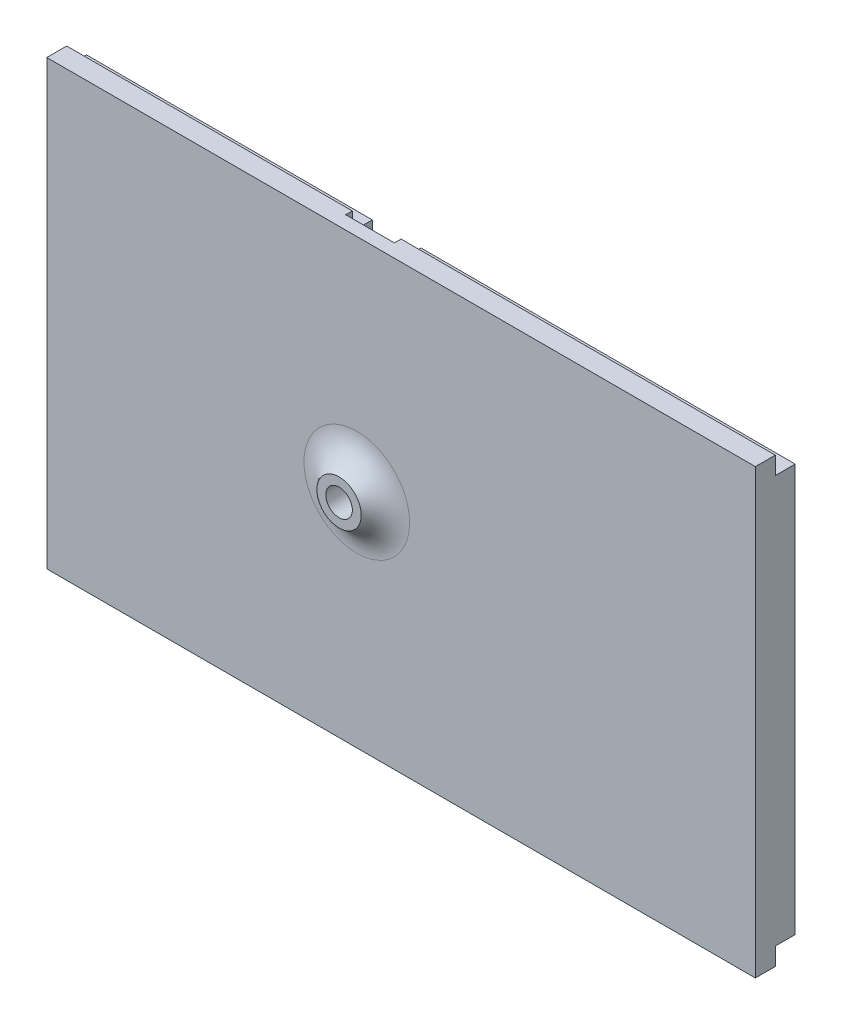
ISO-10303-21;
HEADER;
FILE_DESCRIPTION(('STEP AP214'),'2;1');
FILE_NAME('part.step','',(''),(''),'','','');
FILE_SCHEMA(('AUTOMOTIVE_DESIGN { 1 0 10303 214 1 1 1 1 }'));
ENDSEC;
DATA;
#1=APPLICATION_CONTEXT('core data for automotive mechanical design processes');
#2=APPLICATION_PROTOCOL_DEFINITION('international standard','automotive_design',2000,#1);
#3=PRODUCT_CONTEXT('',#1,'mechanical');
#4=PRODUCT('Part','Part','',(#3));
#5=PRODUCT_RELATED_PRODUCT_CATEGORY('part','',(#4));
#6=PRODUCT_DEFINITION_FORMATION('','',#4);
#7=PRODUCT_DEFINITION_CONTEXT('part definition',#1,'design');
#8=PRODUCT_DEFINITION('design','',#6,#7);
#9=PRODUCT_DEFINITION_SHAPE('','',#8);
#10=(LENGTH_UNIT() NAMED_UNIT(*) SI_UNIT(.MILLI.,.METRE.));
#11=(NAMED_UNIT(*) PLANE_ANGLE_UNIT() SI_UNIT($,.RADIAN.));
#12=(NAMED_UNIT(*) SI_UNIT($,.STERADIAN.) SOLID_ANGLE_UNIT());
#13=UNCERTAINTY_MEASURE_WITH_UNIT(LENGTH_MEASURE(1.E-05),#10,'distance_accuracy_value','');
#14=(GEOMETRIC_REPRESENTATION_CONTEXT(3) GLOBAL_UNCERTAINTY_ASSIGNED_CONTEXT((#13)) GLOBAL_UNIT_ASSIGNED_CONTEXT((#10,
#11,#12)) REPRESENTATION_CONTEXT('',''));
#15=CARTESIAN_POINT('',(0.,0.,0.));
#16=DIRECTION('',(0.,0.,1.));
#17=DIRECTION('',(1.,0.,0.));
#18=AXIS2_PLACEMENT_3D('',#15,#16,#17);
#19=CARTESIAN_POINT('',(0.,50.,2.24999999999999));
#20=DIRECTION('',(0.,0.,1.));
#21=DIRECTION('',(1.,0.,0.));
#22=AXIS2_PLACEMENT_3D('',#19,#20,#21);
#23=PLANE('',#22);
#24=DIRECTION('',(-1.,0.,0.));
#25=VECTOR('',#24,1.);
#26=CARTESIAN_POINT('',(0.,50.,2.24999999999999));
#27=LINE('',#26,#25);
#28=CARTESIAN_POINT('',(-47.75,50.,2.24999999999999));
#29=VERTEX_POINT('',#28);
#30=CARTESIAN_POINT('',(-80.,50.,2.24999999999999));
#31=VERTEX_POINT('',#30);
#32=EDGE_CURVE('E235',#29,#31,#27,.T.);
#33=ORIENTED_EDGE('',*,*,#32,.F.);
#34=DIRECTION('',(0.,-1.,0.));
#35=VECTOR('',#34,1.);
#36=CARTESIAN_POINT('',(-47.75,50.,2.24999999999999));
#37=LINE('',#36,#35);
#38=CARTESIAN_POINT('',(-47.75,48.,2.24999999999999));
#39=VERTEX_POINT('',#38);
#40=EDGE_CURVE('E154',#29,#39,#37,.T.);
#41=ORIENTED_EDGE('',*,*,#40,.T.);
#42=DIRECTION('',(-1.,0.,0.));
#43=VECTOR('',#42,1.);
#44=CARTESIAN_POINT('',(0.,48.,2.24999999999999));
#45=LINE('',#44,#43);
#46=CARTESIAN_POINT('',(-80.,48.,2.24999999999999));
#47=VERTEX_POINT('',#46);
#48=EDGE_CURVE('E240',#39,#47,#45,.T.);
#49=ORIENTED_EDGE('',*,*,#48,.T.);
#50=DIRECTION('',(0.,1.,0.));
#51=VECTOR('',#50,1.);
#52=CARTESIAN_POINT('',(-80.,50.,2.24999999999999));
#53=LINE('',#52,#51);
#54=EDGE_CURVE('E218',#47,#31,#53,.T.);
#55=ORIENTED_EDGE('',*,*,#54,.T.);
#56=EDGE_LOOP('',(#33,#41,#49,#55));
#57=FACE_BOUND('',#56,.T.);
#58=ADVANCED_FACE('F45',(#57),#23,.F.);
#59=CARTESIAN_POINT('',(0.,48.,2.24999999999999));
#60=DIRECTION('',(0.,-1.,0.));
#61=DIRECTION('',(0.,0.,-1.));
#62=AXIS2_PLACEMENT_3D('',#59,#60,#61);
#63=PLANE('',#62);
#64=ORIENTED_EDGE('',*,*,#48,.F.);
#65=DIRECTION('',(0.,0.,-1.));
#66=VECTOR('',#65,1.);
#67=CARTESIAN_POINT('',(-47.75,48.,2.24999999999999));
#68=LINE('',#67,#66);
#69=CARTESIAN_POINT('',(-47.75,48.,0.));
#70=VERTEX_POINT('',#69);
#71=EDGE_CURVE('E11',#39,#70,#68,.T.);
#72=ORIENTED_EDGE('',*,*,#71,.T.);
#73=DIRECTION('',(-1.,0.,0.));
#74=VECTOR('',#73,1.);
#75=CARTESIAN_POINT('',(0.,48.,0.));
#76=LINE('',#75,#74);
#77=CARTESIAN_POINT('',(-80.,48.,0.));
#78=VERTEX_POINT('',#77);
#79=EDGE_CURVE('E222',#70,#78,#76,.T.);
#80=ORIENTED_EDGE('',*,*,#79,.T.);
#81=DIRECTION('',(0.,0.,1.));
#82=VECTOR('',#81,1.);
#83=CARTESIAN_POINT('',(-80.,48.,2.24999999999999));
#84=LINE('',#83,#82);
#85=EDGE_CURVE('E223',#78,#47,#84,.T.);
#86=ORIENTED_EDGE('',*,*,#85,.T.);
#87=EDGE_LOOP('',(#64,#72,#80,#86));
#88=FACE_BOUND('',#87,.T.);
#89=ADVANCED_FACE('F332',(#88),#63,.F.);
#90=CARTESIAN_POINT('',(0.,0.,4.5));
#91=DIRECTION('',(0.,-1.,0.));
#92=DIRECTION('',(1.,0.,0.));
#93=AXIS2_PLACEMENT_3D('',#90,#91,#92);
#94=PLANE('',#93);
#95=DIRECTION('',(-1.,0.,0.));
#96=VECTOR('',#95,1.);
#97=CARTESIAN_POINT('',(0.,0.,2.25));
#98=LINE('',#97,#96);
#99=CARTESIAN_POINT('',(0.,0.,2.25));
#100=VERTEX_POINT('',#99);
#101=CARTESIAN_POINT('',(-80.,0.,2.25));
#102=VERTEX_POINT('',#101);
#103=EDGE_CURVE('E244',#100,#102,#98,.T.);
#104=ORIENTED_EDGE('',*,*,#103,.F.);
#105=DIRECTION('',(0.,0.,-1.));
#106=VECTOR('',#105,1.);
#107=CARTESIAN_POINT('',(0.,0.,4.5));
#108=LINE('',#107,#106);
#109=CARTESIAN_POINT('',(0.,0.,4.5));
#110=VERTEX_POINT('',#109);
#111=EDGE_CURVE('E289',#110,#100,#108,.T.);
#112=ORIENTED_EDGE('',*,*,#111,.F.);
#113=DIRECTION('',(-1.,0.,0.));
#114=VECTOR('',#113,1.);
#115=CARTESIAN_POINT('',(0.,0.,4.5));
#116=LINE('',#115,#114);
#117=CARTESIAN_POINT('',(-80.,0.,4.5));
#118=VERTEX_POINT('',#117);
#119=EDGE_CURVE('E267',#110,#118,#116,.T.);
#120=ORIENTED_EDGE('',*,*,#119,.T.);
#121=DIRECTION('',(0.,0.,-1.));
#122=VECTOR('',#121,1.);
#123=CARTESIAN_POINT('',(-80.,0.,4.5));
#124=LINE('',#123,#122);
#125=EDGE_CURVE('E282',#118,#102,#124,.T.);
#126=ORIENTED_EDGE('',*,*,#125,.T.);
#127=EDGE_LOOP('',(#104,#112,#120,#126));
#128=FACE_BOUND('',#127,.T.);
#129=ADVANCED_FACE('F350',(#128),#94,.T.);
#130=CARTESIAN_POINT('',(0.,0.,4.5));
#131=DIRECTION('',(-1.,0.,0.));
#132=DIRECTION('',(0.,0.,1.));
#133=AXIS2_PLACEMENT_3D('',#130,#131,#132);
#134=PLANE('',#133);
#135=DIRECTION('',(0.,0.,1.));
#136=VECTOR('',#135,1.);
#137=CARTESIAN_POINT('',(0.,48.,2.24999999999999));
#138=LINE('',#137,#136);
#139=CARTESIAN_POINT('',(0.,48.,0.));
#140=VERTEX_POINT('',#139);
#141=CARTESIAN_POINT('',(0.,48.,2.24999999999999));
#142=VERTEX_POINT('',#141);
#143=EDGE_CURVE('E69',#140,#142,#138,.T.);
#144=ORIENTED_EDGE('',*,*,#143,.T.);
#145=DIRECTION('',(0.,1.,0.));
#146=VECTOR('',#145,1.);
#147=CARTESIAN_POINT('',(0.,50.,2.24999999999999));
#148=LINE('',#147,#146);
#149=CARTESIAN_POINT('',(0.,50.,2.24999999999999));
#150=VERTEX_POINT('',#149);
#151=EDGE_CURVE('E217',#142,#150,#148,.T.);
#152=ORIENTED_EDGE('',*,*,#151,.T.);
#153=DIRECTION('',(0.,0.,-1.));
#154=VECTOR('',#153,1.);
#155=CARTESIAN_POINT('',(0.,50.,4.5));
#156=LINE('',#155,#154);
#157=CARTESIAN_POINT('',(0.,50.,4.5));
#158=VERTEX_POINT('',#157);
#159=EDGE_CURVE('E294',#158,#150,#156,.T.);
#160=ORIENTED_EDGE('',*,*,#159,.F.);
#161=DIRECTION('',(0.,1.,0.));
#162=VECTOR('',#161,1.);
#163=CARTESIAN_POINT('',(0.,0.,4.5));
#164=LINE('',#163,#162);
#165=EDGE_CURVE('E279',#110,#158,#164,.T.);
#166=ORIENTED_EDGE('',*,*,#165,.F.);
#167=ORIENTED_EDGE('',*,*,#111,.T.);
#168=DIRECTION('',(0.,1.,0.));
#169=VECTOR('',#168,1.);
#170=CARTESIAN_POINT('',(0.,0.,2.25));
#171=LINE('',#170,#169);
#172=CARTESIAN_POINT('',(0.,1.99999999999999,2.25));
#173=VERTEX_POINT('',#172);
#174=EDGE_CURVE('E257',#100,#173,#171,.T.);
#175=ORIENTED_EDGE('',*,*,#174,.T.);
#176=DIRECTION('',(0.,0.,-1.));
#177=VECTOR('',#176,1.);
#178=CARTESIAN_POINT('',(0.,1.99999999999999,2.25));
#179=LINE('',#178,#177);
#180=CARTESIAN_POINT('',(0.,1.99999999999999,0.));
#181=VERTEX_POINT('',#180);
#182=EDGE_CURVE('E247',#173,#181,#179,.T.);
#183=ORIENTED_EDGE('',*,*,#182,.T.);
#184=DIRECTION('',(0.,1.,0.));
#185=VECTOR('',#184,1.);
#186=CARTESIAN_POINT('',(0.,0.,0.));
#187=LINE('',#186,#185);
#188=EDGE_CURVE('E272',#181,#140,#187,.T.);
#189=ORIENTED_EDGE('',*,*,#188,.T.);
#190=EDGE_LOOP('',(#144,#152,#160,#166,#167,#175,#183,#189));
#191=FACE_BOUND('',#190,.T.);
#192=ADVANCED_FACE('F318',(#191),#134,.F.);
#193=CARTESIAN_POINT('',(0.,50.,4.5));
#194=DIRECTION('',(0.,-1.,0.));
#195=DIRECTION('',(1.,0.,0.));
#196=AXIS2_PLACEMENT_3D('',#193,#194,#195);
#197=PLANE('',#196);
#198=DIRECTION('',(1.,0.,0.));
#199=VECTOR('',#198,1.);
#200=CARTESIAN_POINT('',(-47.75,50.,3.));
#201=LINE('',#200,#199);
#202=CARTESIAN_POINT('',(-47.75,50.,3.));
#203=VERTEX_POINT('',#202);
#204=CARTESIAN_POINT('',(-42.25,50.,3.));
#205=VERTEX_POINT('',#204);
#206=EDGE_CURVE('E167',#203,#205,#201,.T.);
#207=ORIENTED_EDGE('',*,*,#206,.F.);
#208=DIRECTION('',(0.,0.,-1.));
#209=VECTOR('',#208,1.);
#210=CARTESIAN_POINT('',(-47.75,50.,3.));
#211=LINE('',#210,#209);
#212=EDGE_CURVE('E148',#203,#29,#211,.T.);
#213=ORIENTED_EDGE('',*,*,#212,.T.);
#214=ORIENTED_EDGE('',*,*,#32,.T.);
#215=DIRECTION('',(0.,0.,-1.));
#216=VECTOR('',#215,1.);
#217=CARTESIAN_POINT('',(-80.,50.,4.5));
#218=LINE('',#217,#216);
#219=CARTESIAN_POINT('',(-80.,50.,4.5));
#220=VERTEX_POINT('',#219);
#221=EDGE_CURVE('E298',#220,#31,#218,.T.);
#222=ORIENTED_EDGE('',*,*,#221,.F.);
#223=DIRECTION('',(-1.,0.,0.));
#224=VECTOR('',#223,1.);
#225=CARTESIAN_POINT('',(0.,50.,4.5));
#226=LINE('',#225,#224);
#227=EDGE_CURVE('E276',#158,#220,#226,.T.);
#228=ORIENTED_EDGE('',*,*,#227,.F.);
#229=ORIENTED_EDGE('',*,*,#159,.T.);
#230=CARTESIAN_POINT('',(-42.25,50.,2.24999999999999));
#231=VERTEX_POINT('',#230);
#232=EDGE_CURVE('E231',#150,#231,#27,.T.);
#233=ORIENTED_EDGE('',*,*,#232,.T.);
#234=DIRECTION('',(0.,0.,-1.));
#235=VECTOR('',#234,1.);
#236=CARTESIAN_POINT('',(-42.25,50.,3.));
#237=LINE('',#236,#235);
#238=EDGE_CURVE('E159',#205,#231,#237,.T.);
#239=ORIENTED_EDGE('',*,*,#238,.F.);
#240=EDGE_LOOP('',(#207,#213,#214,#222,#228,#229,#233,#239));
#241=FACE_BOUND('',#240,.T.);
#242=ADVANCED_FACE('F173',(#241),#197,.F.);
#243=CARTESIAN_POINT('',(-80.,0.,4.5));
#244=DIRECTION('',(-1.,0.,0.));
#245=DIRECTION('',(0.,0.,1.));
#246=AXIS2_PLACEMENT_3D('',#243,#244,#245);
#247=PLANE('',#246);
#248=ORIENTED_EDGE('',*,*,#54,.F.);
#249=ORIENTED_EDGE('',*,*,#85,.F.);
#250=DIRECTION('',(0.,1.,0.));
#251=VECTOR('',#250,1.);
#252=CARTESIAN_POINT('',(-80.,0.,0.));
#253=LINE('',#252,#251);
#254=CARTESIAN_POINT('',(-80.,1.99999999999999,0.));
#255=VERTEX_POINT('',#254);
#256=EDGE_CURVE('E234',#255,#78,#253,.T.);
#257=ORIENTED_EDGE('',*,*,#256,.F.);
#258=DIRECTION('',(0.,0.,-1.));
#259=VECTOR('',#258,1.);
#260=CARTESIAN_POINT('',(-80.,1.99999999999999,2.25));
#261=LINE('',#260,#259);
#262=CARTESIAN_POINT('',(-80.,1.99999999999999,2.25));
#263=VERTEX_POINT('',#262);
#264=EDGE_CURVE('E254',#263,#255,#261,.T.);
#265=ORIENTED_EDGE('',*,*,#264,.F.);
#266=DIRECTION('',(0.,1.,0.));
#267=VECTOR('',#266,1.);
#268=CARTESIAN_POINT('',(-80.,0.,2.25));
#269=LINE('',#268,#267);
#270=EDGE_CURVE('E227',#102,#263,#269,.T.);
#271=ORIENTED_EDGE('',*,*,#270,.F.);
#272=ORIENTED_EDGE('',*,*,#125,.F.);
#273=DIRECTION('',(0.,1.,0.));
#274=VECTOR('',#273,1.);
#275=CARTESIAN_POINT('',(-80.,0.,4.5));
#276=LINE('',#275,#274);
#277=EDGE_CURVE('E271',#118,#220,#276,.T.);
#278=ORIENTED_EDGE('',*,*,#277,.T.);
#279=ORIENTED_EDGE('',*,*,#221,.T.);
#280=EDGE_LOOP('',(#248,#249,#257,#265,#271,#272,#278,#279));
#281=FACE_BOUND('',#280,.T.);
#282=ADVANCED_FACE('F342',(#281),#247,.T.);
#283=CARTESIAN_POINT('',(0.,0.,4.5));
#284=DIRECTION('',(0.,0.,-1.));
#285=DIRECTION('',(-1.,0.,0.));
#286=AXIS2_PLACEMENT_3D('',#283,#284,#285);
#287=PLANE('',#286);
#288=CARTESIAN_POINT('',(-45.,25.,4.5));
#289=DIRECTION('',(0.,0.,-1.));
#290=DIRECTION('',(-1.,0.,0.));
#291=AXIS2_PLACEMENT_3D('',#288,#289,#290);
#292=CIRCLE('',#291,5.96410161513776);
#293=CARTESIAN_POINT('',(-50.9641016151378,25.,4.5));
#294=VERTEX_POINT('',#293);
#295=EDGE_CURVE('E293',#294,#294,#292,.T.);
#296=ORIENTED_EDGE('',*,*,#295,.T.);
#297=EDGE_LOOP('',(#296));
#298=FACE_BOUND('',#297,.T.);
#299=ORIENTED_EDGE('',*,*,#119,.F.);
#300=ORIENTED_EDGE('',*,*,#165,.T.);
#301=ORIENTED_EDGE('',*,*,#227,.T.);
#302=ORIENTED_EDGE('',*,*,#277,.F.);
#303=EDGE_LOOP('',(#299,#300,#301,#302));
#304=FACE_BOUND('',#303,.T.);
#305=ADVANCED_FACE('F347',(#298,#304),#287,.F.);
#306=CARTESIAN_POINT('',(0.,0.,0.));
#307=DIRECTION('',(0.,0.,-1.));
#308=DIRECTION('',(-1.,0.,0.));
#309=AXIS2_PLACEMENT_3D('',#306,#307,#308);
#310=PLANE('',#309);
#311=DIRECTION('',(0.,1.,0.));
#312=VECTOR('',#311,1.);
#313=CARTESIAN_POINT('',(-47.75,50.,0.));
#314=LINE('',#313,#312);
#315=CARTESIAN_POINT('',(-47.75,20.,0.));
#316=VERTEX_POINT('',#315);
#317=EDGE_CURVE('E183',#316,#70,#314,.T.);
#318=ORIENTED_EDGE('',*,*,#317,.F.);
#319=DIRECTION('',(-1.,0.,0.));
#320=VECTOR('',#319,1.);
#321=CARTESIAN_POINT('',(-47.75,20.,0.));
#322=LINE('',#321,#320);
#323=CARTESIAN_POINT('',(-42.25,20.,0.));
#324=VERTEX_POINT('',#323);
#325=EDGE_CURVE('E171',#324,#316,#322,.T.);
#326=ORIENTED_EDGE('',*,*,#325,.F.);
#327=DIRECTION('',(0.,-1.,0.));
#328=VECTOR('',#327,1.);
#329=CARTESIAN_POINT('',(-42.25,50.,0.));
#330=LINE('',#329,#328);
#331=CARTESIAN_POINT('',(-42.25,48.,0.));
#332=VERTEX_POINT('',#331);
#333=EDGE_CURVE('E186',#332,#324,#330,.T.);
#334=ORIENTED_EDGE('',*,*,#333,.F.);
#335=EDGE_CURVE('E241',#140,#332,#76,.T.);
#336=ORIENTED_EDGE('',*,*,#335,.F.);
#337=ORIENTED_EDGE('',*,*,#188,.F.);
#338=DIRECTION('',(-1.,0.,0.));
#339=VECTOR('',#338,1.);
#340=CARTESIAN_POINT('',(0.,1.99999999999999,0.));
#341=LINE('',#340,#339);
#342=EDGE_CURVE('E214',#181,#255,#341,.T.);
#343=ORIENTED_EDGE('',*,*,#342,.T.);
#344=ORIENTED_EDGE('',*,*,#256,.T.);
#345=ORIENTED_EDGE('',*,*,#79,.F.);
#346=EDGE_LOOP('',(#318,#326,#334,#336,#337,#343,#344,#345));
#347=FACE_BOUND('',#346,.T.);
#348=ADVANCED_FACE('F323',(#347),#310,.T.);
#349=CARTESIAN_POINT('',(0.,1.99999999999999,2.25));
#350=DIRECTION('',(0.,1.,0.));
#351=DIRECTION('',(0.,0.,1.));
#352=AXIS2_PLACEMENT_3D('',#349,#350,#351);
#353=PLANE('',#352);
#354=ORIENTED_EDGE('',*,*,#264,.T.);
#355=ORIENTED_EDGE('',*,*,#342,.F.);
#356=ORIENTED_EDGE('',*,*,#182,.F.);
#357=DIRECTION('',(-1.,0.,0.));
#358=VECTOR('',#357,1.);
#359=CARTESIAN_POINT('',(0.,1.99999999999999,2.25));
#360=LINE('',#359,#358);
#361=EDGE_CURVE('E248',#173,#263,#360,.T.);
#362=ORIENTED_EDGE('',*,*,#361,.T.);
#363=EDGE_LOOP('',(#354,#355,#356,#362));
#364=FACE_BOUND('',#363,.T.);
#365=ADVANCED_FACE('F356',(#364),#353,.F.);
#366=CARTESIAN_POINT('',(0.,0.,2.25));
#367=DIRECTION('',(0.,0.,1.));
#368=DIRECTION('',(1.,0.,0.));
#369=AXIS2_PLACEMENT_3D('',#366,#367,#368);
#370=PLANE('',#369);
#371=ORIENTED_EDGE('',*,*,#270,.T.);
#372=ORIENTED_EDGE('',*,*,#361,.F.);
#373=ORIENTED_EDGE('',*,*,#174,.F.);
#374=ORIENTED_EDGE('',*,*,#103,.T.);
#375=EDGE_LOOP('',(#371,#372,#373,#374));
#376=FACE_BOUND('',#375,.T.);
#377=ADVANCED_FACE('F353',(#376),#370,.F.);
#378=CARTESIAN_POINT('',(-42.25,48.,2.24999999999999));
#379=VERTEX_POINT('',#378);
#380=EDGE_CURVE('E236',#142,#379,#45,.T.);
#381=ORIENTED_EDGE('',*,*,#380,.T.);
#382=DIRECTION('',(0.,1.,0.));
#383=VECTOR('',#382,1.);
#384=CARTESIAN_POINT('',(-42.25,50.,2.24999999999999));
#385=LINE('',#384,#383);
#386=EDGE_CURVE('E61',#379,#231,#385,.T.);
#387=ORIENTED_EDGE('',*,*,#386,.T.);
#388=ORIENTED_EDGE('',*,*,#232,.F.);
#389=ORIENTED_EDGE('',*,*,#151,.F.);
#390=EDGE_LOOP('',(#381,#387,#388,#389));
#391=FACE_BOUND('',#390,.T.);
#392=ADVANCED_FACE('F315',(#391),#23,.F.);
#393=ORIENTED_EDGE('',*,*,#335,.T.);
#394=DIRECTION('',(0.,0.,1.));
#395=VECTOR('',#394,1.);
#396=CARTESIAN_POINT('',(-42.25,48.,2.24999999999999));
#397=LINE('',#396,#395);
#398=EDGE_CURVE('E54',#332,#379,#397,.T.);
#399=ORIENTED_EDGE('',*,*,#398,.T.);
#400=ORIENTED_EDGE('',*,*,#380,.F.);
#401=ORIENTED_EDGE('',*,*,#143,.F.);
#402=EDGE_LOOP('',(#393,#399,#400,#401));
#403=FACE_BOUND('',#402,.T.);
#404=ADVANCED_FACE('F311',(#403),#63,.F.);
#405=CARTESIAN_POINT('',(-45.,25.,6.5));
#406=DIRECTION('',(0.,0.,1.));
#407=DIRECTION('',(1.,0.,0.));
#408=AXIS2_PLACEMENT_3D('',#405,#406,#407);
#409=PLANE('',#408);
#410=CARTESIAN_POINT('',(-45.,25.,6.5));
#411=DIRECTION('',(0.,0.,1.));
#412=DIRECTION('',(1.,0.,0.));
#413=AXIS2_PLACEMENT_3D('',#410,#411,#412);
#414=CIRCLE('',#413,1.5);
#415=CARTESIAN_POINT('',(-43.5,25.,6.5));
#416=VERTEX_POINT('',#415);
#417=EDGE_CURVE('E206',#416,#416,#414,.T.);
#418=ORIENTED_EDGE('',*,*,#417,.F.);
#419=EDGE_LOOP('',(#418));
#420=FACE_BOUND('',#419,.T.);
#421=CARTESIAN_POINT('',(-45.,25.,6.5));
#422=DIRECTION('',(0.,0.,1.));
#423=DIRECTION('',(1.,0.,0.));
#424=AXIS2_PLACEMENT_3D('',#421,#422,#423);
#425=CIRCLE('',#424,2.5);
#426=CARTESIAN_POINT('',(-42.5,25.,6.5));
#427=VERTEX_POINT('',#426);
#428=EDGE_CURVE('E210',#427,#427,#425,.T.);
#429=ORIENTED_EDGE('',*,*,#428,.T.);
#430=EDGE_LOOP('',(#429));
#431=FACE_BOUND('',#430,.T.);
#432=ADVANCED_FACE('F379',(#420,#431),#409,.T.);
#433=CARTESIAN_POINT('',(-45.,25.,0.));
#434=DIRECTION('',(0.,0.,1.));
#435=DIRECTION('',(1.,0.,0.));
#436=AXIS2_PLACEMENT_3D('',#433,#434,#435);
#437=CYLINDRICAL_SURFACE('',#436,1.5);
#438=CARTESIAN_POINT('',(-45.,25.,3.));
#439=DIRECTION('',(0.,0.,1.));
#440=DIRECTION('',(1.,0.,0.));
#441=AXIS2_PLACEMENT_3D('',#438,#439,#440);
#442=CIRCLE('',#441,1.5);
#443=CARTESIAN_POINT('',(-43.5,25.,3.));
#444=VERTEX_POINT('',#443);
#445=EDGE_CURVE('E195',#444,#444,#442,.F.);
#446=CARTESIAN_POINT('',(-43.5,25.,3.));
#447=CARTESIAN_POINT('',(-43.5,25.,3.03645833333333));
#448=CARTESIAN_POINT('',(-43.5,25.,3.07291666666667));
#449=CARTESIAN_POINT('',(-43.5,25.,3.14583333333333));
#450=CARTESIAN_POINT('',(-43.5,25.,3.18229166666667));
#451=CARTESIAN_POINT('',(-43.5,25.,3.25520833333333));
#452=CARTESIAN_POINT('',(-43.5,25.,3.29166666666667));
#453=CARTESIAN_POINT('',(-43.5,25.,3.36458333333333));
#454=CARTESIAN_POINT('',(-43.5,25.,3.40104166666667));
#455=CARTESIAN_POINT('',(-43.5,25.,3.47395833333333));
#456=CARTESIAN_POINT('',(-43.5,25.,3.51041666666667));
#457=CARTESIAN_POINT('',(-43.5,25.,3.58333333333333));
#458=CARTESIAN_POINT('',(-43.5,25.,3.61979166666667));
#459=CARTESIAN_POINT('',(-43.5,25.,3.69270833333333));
#460=CARTESIAN_POINT('',(-43.5,25.,3.72916666666667));
#461=CARTESIAN_POINT('',(-43.5,25.,3.80208333333333));
#462=CARTESIAN_POINT('',(-43.5,25.,3.83854166666667));
#463=CARTESIAN_POINT('',(-43.5,25.,3.91145833333333));
#464=CARTESIAN_POINT('',(-43.5,25.,3.94791666666667));
#465=CARTESIAN_POINT('',(-43.5,25.,4.02083333333333));
#466=CARTESIAN_POINT('',(-43.5,25.,4.05729166666667));
#467=CARTESIAN_POINT('',(-43.5,25.,4.13020833333333));
#468=CARTESIAN_POINT('',(-43.5,25.,4.16666666666667));
#469=CARTESIAN_POINT('',(-43.5,25.,4.23958333333333));
#470=CARTESIAN_POINT('',(-43.5,25.,4.27604166666667));
#471=CARTESIAN_POINT('',(-43.5,25.,4.34895833333333));
#472=CARTESIAN_POINT('',(-43.5,25.,4.38541666666667));
#473=CARTESIAN_POINT('',(-43.5,25.,4.45833333333333));
#474=CARTESIAN_POINT('',(-43.5,25.,4.49479166666667));
#475=CARTESIAN_POINT('',(-43.5,25.,4.56770833333333));
#476=CARTESIAN_POINT('',(-43.5,25.,4.60416666666667));
#477=CARTESIAN_POINT('',(-43.5,25.,4.67708333333333));
#478=CARTESIAN_POINT('',(-43.5,25.,4.71354166666667));
#479=CARTESIAN_POINT('',(-43.5,25.,4.78645833333333));
#480=CARTESIAN_POINT('',(-43.5,25.,4.82291666666667));
#481=CARTESIAN_POINT('',(-43.5,25.,4.89583333333333));
#482=CARTESIAN_POINT('',(-43.5,25.,4.93229166666667));
#483=CARTESIAN_POINT('',(-43.5,25.,5.00520833333333));
#484=CARTESIAN_POINT('',(-43.5,25.,5.04166666666667));
#485=CARTESIAN_POINT('',(-43.5,25.,5.11458333333333));
#486=CARTESIAN_POINT('',(-43.5,25.,5.15104166666667));
#487=CARTESIAN_POINT('',(-43.5,25.,5.22395833333333));
#488=CARTESIAN_POINT('',(-43.5,25.,5.26041666666667));
#489=CARTESIAN_POINT('',(-43.5,25.,5.33333333333333));
#490=CARTESIAN_POINT('',(-43.5,25.,5.36979166666667));
#491=CARTESIAN_POINT('',(-43.5,25.,5.44270833333333));
#492=CARTESIAN_POINT('',(-43.5,25.,5.47916666666667));
#493=CARTESIAN_POINT('',(-43.5,25.,5.55208333333333));
#494=CARTESIAN_POINT('',(-43.5,25.,5.58854166666667));
#495=CARTESIAN_POINT('',(-43.5,25.,5.66145833333333));
#496=CARTESIAN_POINT('',(-43.5,25.,5.69791666666667));
#497=CARTESIAN_POINT('',(-43.5,25.,5.77083333333333));
#498=CARTESIAN_POINT('',(-43.5,25.,5.80729166666667));
#499=CARTESIAN_POINT('',(-43.5,25.,5.88020833333333));
#500=CARTESIAN_POINT('',(-43.5,25.,5.91666666666667));
#501=CARTESIAN_POINT('',(-43.5,25.,5.98958333333333));
#502=CARTESIAN_POINT('',(-43.5,25.,6.02604166666667));
#503=CARTESIAN_POINT('',(-43.5,25.,6.09895833333333));
#504=CARTESIAN_POINT('',(-43.5,25.,6.13541666666667));
#505=CARTESIAN_POINT('',(-43.5,25.,6.20833333333333));
#506=CARTESIAN_POINT('',(-43.5,25.,6.24479166666667));
#507=CARTESIAN_POINT('',(-43.5,25.,6.31770833333333));
#508=CARTESIAN_POINT('',(-43.5,25.,6.35416666666667));
#509=CARTESIAN_POINT('',(-43.5,25.,6.42708333333333));
#510=CARTESIAN_POINT('',(-43.5,25.,6.46354166666667));
#511=CARTESIAN_POINT('',(-43.5,25.,6.5));
#512=B_SPLINE_CURVE_WITH_KNOTS('',3,(#446,#447,#448,#449,#450,#451,#452,#453,#454,#455,#456,
#457,#458,#459,#460,#461,#462,#463,#464,#465,#466,#467,#468,#469,#470,#471,#472,#473,#474,#475,
#476,#477,#478,#479,#480,#481,#482,#483,#484,#485,#486,#487,#488,#489,#490,#491,#492,#493,#494,
#495,#496,#497,#498,#499,#500,#501,#502,#503,#504,#505,#506,#507,#508,#509,#510,#511),
.UNSPECIFIED.,.F.,.F.,(4,2,2,2,2,2,2,2,2,2,2,2,2,2,2,2,2,2,2,2,2,2,2,2,2,2,2,2,2,2,2,2,4),(0.,
0.109375,0.21875,0.328125,0.4375,0.546875,0.65625,0.765625,0.875,0.984375,1.09375,1.203125,
1.3125,1.421875,1.53125,1.640625,1.75,1.859375,1.96875,2.078125,2.1875,2.296875,2.40625,
2.515625,2.625,2.734375,2.84375,2.953125,3.0625,3.171875,3.28125,3.390625,3.5),.UNSPECIFIED.);
#513=EDGE_CURVE('BSEAM384',#444,#416,#512,.T.);
#514=ORIENTED_EDGE('',*,*,#445,.T.);
#515=ORIENTED_EDGE('',*,*,#417,.T.);
#516=ORIENTED_EDGE('',*,*,#513,.T.);
#517=ORIENTED_EDGE('',*,*,#513,.F.);
#518=EDGE_LOOP('',(#514,#516,#515,#517));
#519=FACE_BOUND('',#518,.T.);
#520=ADVANCED_FACE('F384',(#519),#437,.F.);
#521=CARTESIAN_POINT('',(-45.,25.,8.5));
#522=DIRECTION('',(0.,0.,-1.));
#523=DIRECTION('',(-1.,0.,0.));
#524=AXIS2_PLACEMENT_3D('',#521,#522,#523);
#525=TOROIDAL_SURFACE('',#524,5.96410161513776,4.);
#526=ORIENTED_EDGE('',*,*,#295,.F.);
#527=EDGE_LOOP('',(#526));
#528=FACE_BOUND('',#527,.T.);
#529=ORIENTED_EDGE('',*,*,#428,.F.);
#530=EDGE_LOOP('',(#529));
#531=FACE_BOUND('',#530,.T.);
#532=ADVANCED_FACE('F47',(#528,#531),#525,.F.);
#533=CARTESIAN_POINT('',(-47.75,50.,3.));
#534=DIRECTION('',(-1.,0.,0.));
#535=DIRECTION('',(0.,0.,1.));
#536=AXIS2_PLACEMENT_3D('',#533,#534,#535);
#537=PLANE('',#536);
#538=ORIENTED_EDGE('',*,*,#212,.F.);
#539=DIRECTION('',(0.,1.,0.));
#540=VECTOR('',#539,1.);
#541=CARTESIAN_POINT('',(-47.75,50.,3.));
#542=LINE('',#541,#540);
#543=CARTESIAN_POINT('',(-47.75,20.,3.));
#544=VERTEX_POINT('',#543);
#545=EDGE_CURVE('E151',#544,#203,#542,.T.);
#546=ORIENTED_EDGE('',*,*,#545,.F.);
#547=DIRECTION('',(0.,0.,-1.));
#548=VECTOR('',#547,1.);
#549=CARTESIAN_POINT('',(-47.75,20.,3.));
#550=LINE('',#549,#548);
#551=EDGE_CURVE('E192',#544,#316,#550,.T.);
#552=ORIENTED_EDGE('',*,*,#551,.T.);
#553=ORIENTED_EDGE('',*,*,#317,.T.);
#554=ORIENTED_EDGE('',*,*,#71,.F.);
#555=ORIENTED_EDGE('',*,*,#40,.F.);
#556=EDGE_LOOP('',(#538,#546,#552,#553,#554,#555));
#557=FACE_BOUND('',#556,.T.);
#558=ADVANCED_FACE('F150',(#557),#537,.F.);
#559=CARTESIAN_POINT('',(-42.25,50.,3.));
#560=DIRECTION('',(1.,0.,0.));
#561=DIRECTION('',(0.,0.,-1.));
#562=AXIS2_PLACEMENT_3D('',#559,#560,#561);
#563=PLANE('',#562);
#564=ORIENTED_EDGE('',*,*,#398,.F.);
#565=ORIENTED_EDGE('',*,*,#333,.T.);
#566=DIRECTION('',(0.,0.,-1.));
#567=VECTOR('',#566,1.);
#568=CARTESIAN_POINT('',(-42.25,20.,3.));
#569=LINE('',#568,#567);
#570=CARTESIAN_POINT('',(-42.25,20.,3.));
#571=VERTEX_POINT('',#570);
#572=EDGE_CURVE('E196',#571,#324,#569,.T.);
#573=ORIENTED_EDGE('',*,*,#572,.F.);
#574=DIRECTION('',(0.,-1.,0.));
#575=VECTOR('',#574,1.);
#576=CARTESIAN_POINT('',(-42.25,50.,3.));
#577=LINE('',#576,#575);
#578=EDGE_CURVE('E176',#205,#571,#577,.T.);
#579=ORIENTED_EDGE('',*,*,#578,.F.);
#580=ORIENTED_EDGE('',*,*,#238,.T.);
#581=ORIENTED_EDGE('',*,*,#386,.F.);
#582=EDGE_LOOP('',(#564,#565,#573,#579,#580,#581));
#583=FACE_BOUND('',#582,.T.);
#584=ADVANCED_FACE('F326',(#583),#563,.F.);
#585=CARTESIAN_POINT('',(0.,0.,3.));
#586=DIRECTION('',(0.,0.,1.));
#587=DIRECTION('',(1.,0.,0.));
#588=AXIS2_PLACEMENT_3D('',#585,#586,#587);
#589=PLANE('',#588);
#590=ORIENTED_EDGE('',*,*,#545,.T.);
#591=ORIENTED_EDGE('',*,*,#206,.T.);
#592=ORIENTED_EDGE('',*,*,#578,.T.);
#593=DIRECTION('',(-1.,0.,0.));
#594=VECTOR('',#593,1.);
#595=CARTESIAN_POINT('',(-47.75,20.,3.));
#596=LINE('',#595,#594);
#597=EDGE_CURVE('E160',#571,#544,#596,.T.);
#598=ORIENTED_EDGE('',*,*,#597,.T.);
#599=EDGE_LOOP('',(#590,#591,#592,#598));
#600=FACE_BOUND('',#599,.T.);
#601=ORIENTED_EDGE('',*,*,#445,.F.);
#602=EDGE_LOOP('',(#601));
#603=FACE_BOUND('',#602,.T.);
#604=ADVANCED_FACE('F164',(#600,#603),#589,.F.);
#605=CARTESIAN_POINT('',(-47.75,20.,3.));
#606=DIRECTION('',(0.,-1.,0.));
#607=DIRECTION('',(0.,0.,-1.));
#608=AXIS2_PLACEMENT_3D('',#605,#606,#607);
#609=PLANE('',#608);
#610=ORIENTED_EDGE('',*,*,#325,.T.);
#611=ORIENTED_EDGE('',*,*,#551,.F.);
#612=ORIENTED_EDGE('',*,*,#597,.F.);
#613=ORIENTED_EDGE('',*,*,#572,.T.);
#614=EDGE_LOOP('',(#610,#611,#612,#613));
#615=FACE_BOUND('',#614,.T.);
#616=ADVANCED_FACE('F328',(#615),#609,.F.);
#617=CLOSED_SHELL('',(#58,#89,#129,#192,#242,#282,#305,#348,#365,#377,#392,#404,#432,#520,#532,
#558,#584,#604,#616));
#618=MANIFOLD_SOLID_BREP('B2',#617);
#619=ADVANCED_BREP_SHAPE_REPRESENTATION('',(#18,#618),#14);
#620=SHAPE_DEFINITION_REPRESENTATION(#9,#619);
ENDSEC;
END-ISO-10303-21;
